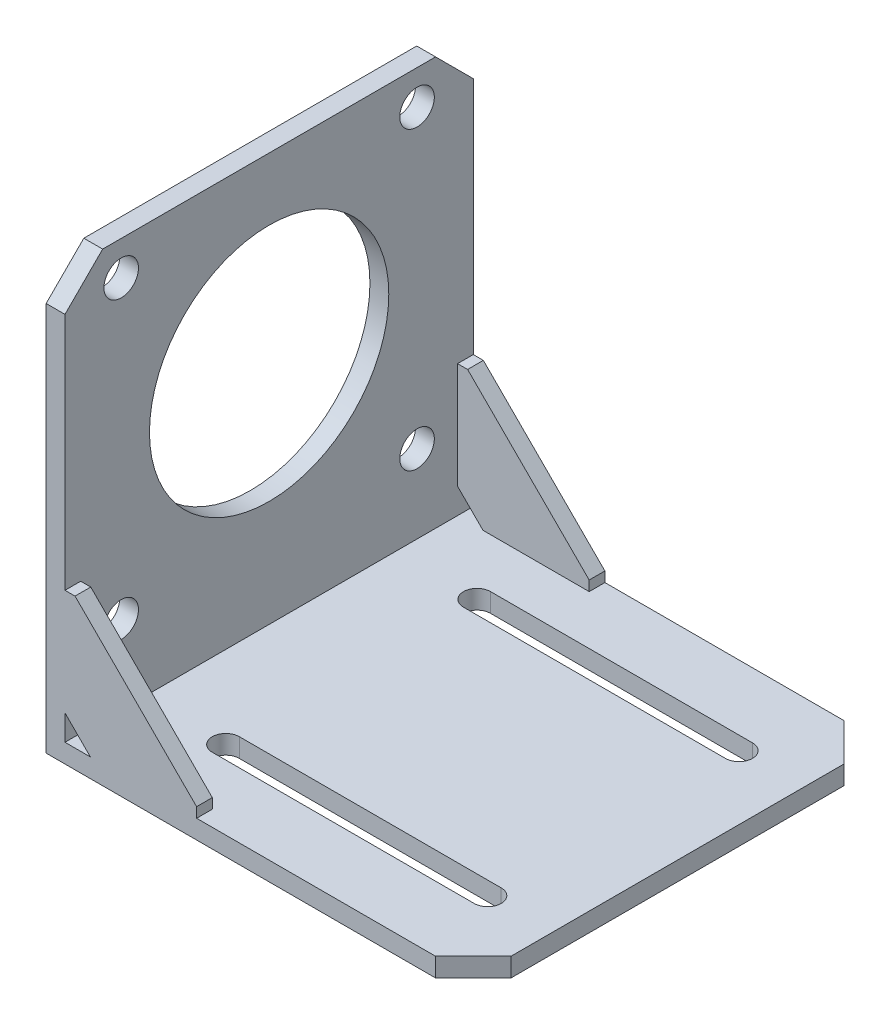
ISO-10303-21;
HEADER;
FILE_DESCRIPTION(('STEP AP214'),'2;1');
FILE_NAME('part.step','',(''),(''),'','','');
FILE_SCHEMA(('AUTOMOTIVE_DESIGN { 1 0 10303 214 1 1 1 1 }'));
ENDSEC;
DATA;
#1=APPLICATION_CONTEXT('core data for automotive mechanical design processes');
#2=APPLICATION_PROTOCOL_DEFINITION('international standard','automotive_design',2000,#1);
#3=PRODUCT_CONTEXT('',#1,'mechanical');
#4=PRODUCT('Part','Part','',(#3));
#5=PRODUCT_RELATED_PRODUCT_CATEGORY('part','',(#4));
#6=PRODUCT_DEFINITION_FORMATION('','',#4);
#7=PRODUCT_DEFINITION_CONTEXT('part definition',#1,'design');
#8=PRODUCT_DEFINITION('design','',#6,#7);
#9=PRODUCT_DEFINITION_SHAPE('','',#8);
#10=(LENGTH_UNIT() NAMED_UNIT(*) SI_UNIT(.MILLI.,.METRE.));
#11=(NAMED_UNIT(*) PLANE_ANGLE_UNIT() SI_UNIT($,.RADIAN.));
#12=(NAMED_UNIT(*) SI_UNIT($,.STERADIAN.) SOLID_ANGLE_UNIT());
#13=UNCERTAINTY_MEASURE_WITH_UNIT(LENGTH_MEASURE(1.E-05),#10,'distance_accuracy_value','');
#14=(GEOMETRIC_REPRESENTATION_CONTEXT(3) GLOBAL_UNCERTAINTY_ASSIGNED_CONTEXT((#13)) GLOBAL_UNIT_ASSIGNED_CONTEXT((#10,
#11,#12)) REPRESENTATION_CONTEXT('',''));
#15=CARTESIAN_POINT('',(0.,0.,0.));
#16=DIRECTION('',(0.,0.,1.));
#17=DIRECTION('',(1.,0.,0.));
#18=AXIS2_PLACEMENT_3D('',#15,#16,#17);
#19=CARTESIAN_POINT('',(3.,3.,65.));
#20=DIRECTION('',(0.,-1.,0.));
#21=DIRECTION('',(1.,0.,0.));
#22=AXIS2_PLACEMENT_3D('',#19,#20,#21);
#23=PLANE('',#22);
#24=DIRECTION('',(-1.,0.,0.));
#25=VECTOR('',#24,1.);
#26=CARTESIAN_POINT('',(16.1,3.,14.65));
#27=LINE('',#26,#25);
#28=CARTESIAN_POINT('',(57.8,3.,14.65));
#29=VERTEX_POINT('',#28);
#30=CARTESIAN_POINT('',(16.1,3.,14.65));
#31=VERTEX_POINT('',#30);
#32=EDGE_CURVE('E236',#29,#31,#27,.T.);
#33=ORIENTED_EDGE('',*,*,#32,.T.);
#34=CARTESIAN_POINT('',(16.1,3.,12.5));
#35=DIRECTION('',(0.,-1.,0.));
#36=DIRECTION('',(1.,0.,0.));
#37=AXIS2_PLACEMENT_3D('',#34,#35,#36);
#38=CIRCLE('',#37,2.15);
#39=CARTESIAN_POINT('',(16.1,3.,10.35));
#40=VERTEX_POINT('',#39);
#41=EDGE_CURVE('E230',#31,#40,#38,.T.);
#42=ORIENTED_EDGE('',*,*,#41,.T.);
#43=DIRECTION('',(1.,0.,0.));
#44=VECTOR('',#43,1.);
#45=CARTESIAN_POINT('',(16.1,3.,10.35));
#46=LINE('',#45,#44);
#47=CARTESIAN_POINT('',(57.8,3.,10.35));
#48=VERTEX_POINT('',#47);
#49=EDGE_CURVE('E239',#40,#48,#46,.T.);
#50=ORIENTED_EDGE('',*,*,#49,.T.);
#51=CARTESIAN_POINT('',(57.8,3.,12.5));
#52=DIRECTION('',(0.,-1.,0.));
#53=DIRECTION('',(1.,0.,0.));
#54=AXIS2_PLACEMENT_3D('',#51,#52,#53);
#55=CIRCLE('',#54,2.15);
#56=EDGE_CURVE('E47',#48,#29,#55,.T.);
#57=ORIENTED_EDGE('',*,*,#56,.T.);
#58=EDGE_LOOP('',(#33,#42,#50,#57));
#59=FACE_BOUND('',#58,.T.);
#60=DIRECTION('',(-1.,0.,0.));
#61=VECTOR('',#60,1.);
#62=CARTESIAN_POINT('',(16.1,3.,54.65));
#63=LINE('',#62,#61);
#64=CARTESIAN_POINT('',(57.8,3.,54.65));
#65=VERTEX_POINT('',#64);
#66=CARTESIAN_POINT('',(16.1,3.,54.65));
#67=VERTEX_POINT('',#66);
#68=EDGE_CURVE('E274',#65,#67,#63,.T.);
#69=ORIENTED_EDGE('',*,*,#68,.T.);
#70=CARTESIAN_POINT('',(16.1,3.,52.5));
#71=DIRECTION('',(0.,-1.,0.));
#72=DIRECTION('',(1.,0.,0.));
#73=AXIS2_PLACEMENT_3D('',#70,#71,#72);
#74=CIRCLE('',#73,2.15);
#75=CARTESIAN_POINT('',(16.1,3.,50.35));
#76=VERTEX_POINT('',#75);
#77=EDGE_CURVE('E264',#67,#76,#74,.T.);
#78=ORIENTED_EDGE('',*,*,#77,.T.);
#79=DIRECTION('',(1.,0.,0.));
#80=VECTOR('',#79,1.);
#81=CARTESIAN_POINT('',(16.1,3.,50.35));
#82=LINE('',#81,#80);
#83=CARTESIAN_POINT('',(57.8,3.,50.35));
#84=VERTEX_POINT('',#83);
#85=EDGE_CURVE('E267',#76,#84,#82,.T.);
#86=ORIENTED_EDGE('',*,*,#85,.T.);
#87=CARTESIAN_POINT('',(57.8,3.,52.5));
#88=DIRECTION('',(0.,-1.,0.));
#89=DIRECTION('',(1.,0.,0.));
#90=AXIS2_PLACEMENT_3D('',#87,#88,#89);
#91=CIRCLE('',#90,2.15);
#92=EDGE_CURVE('E271',#84,#65,#91,.T.);
#93=ORIENTED_EDGE('',*,*,#92,.T.);
#94=EDGE_LOOP('',(#69,#78,#86,#93));
#95=FACE_BOUND('',#94,.T.);
#96=DIRECTION('',(0.,0.,-1.));
#97=VECTOR('',#96,1.);
#98=CARTESIAN_POINT('',(7.04782201567098,3.00000000000002,2.5));
#99=LINE('',#98,#97);
#100=CARTESIAN_POINT('',(7.04782201567101,3.,2.5));
#101=VERTEX_POINT('',#100);
#102=CARTESIAN_POINT('',(7.04782201567098,3.00000000000002,0.));
#103=VERTEX_POINT('',#102);
#104=EDGE_CURVE('E352',#101,#103,#99,.T.);
#105=ORIENTED_EDGE('',*,*,#104,.T.);
#106=DIRECTION('',(-1.,0.,0.));
#107=VECTOR('',#106,1.);
#108=CARTESIAN_POINT('',(3.,3.,0.));
#109=LINE('',#108,#107);
#110=CARTESIAN_POINT('',(3.,3.,0.));
#111=VERTEX_POINT('',#110);
#112=EDGE_CURVE('E430',#103,#111,#109,.T.);
#113=ORIENTED_EDGE('',*,*,#112,.T.);
#114=DIRECTION('',(0.,0.,-1.));
#115=VECTOR('',#114,1.);
#116=CARTESIAN_POINT('',(3.,3.,65.));
#117=LINE('',#116,#115);
#118=CARTESIAN_POINT('',(3.,3.,65.));
#119=VERTEX_POINT('',#118);
#120=EDGE_CURVE('E445',#119,#111,#117,.T.);
#121=ORIENTED_EDGE('',*,*,#120,.F.);
#122=DIRECTION('',(-1.,0.,0.));
#123=VECTOR('',#122,1.);
#124=CARTESIAN_POINT('',(3.,3.,65.));
#125=LINE('',#124,#123);
#126=CARTESIAN_POINT('',(7.04782201567098,3.,65.));
#127=VERTEX_POINT('',#126);
#128=EDGE_CURVE('E416',#127,#119,#125,.T.);
#129=ORIENTED_EDGE('',*,*,#128,.F.);
#130=DIRECTION('',(0.,0.,1.));
#131=VECTOR('',#130,1.);
#132=CARTESIAN_POINT('',(7.04782201567098,3.00000000000002,62.5));
#133=LINE('',#132,#131);
#134=CARTESIAN_POINT('',(7.04782201567098,3.00000000000002,62.5));
#135=VERTEX_POINT('',#134);
#136=EDGE_CURVE('E388',#135,#127,#133,.T.);
#137=ORIENTED_EDGE('',*,*,#136,.F.);
#138=DIRECTION('',(1.,0.,0.));
#139=VECTOR('',#138,1.);
#140=CARTESIAN_POINT('',(23.9558780924768,3.00000000000002,62.5));
#141=LINE('',#140,#139);
#142=CARTESIAN_POINT('',(23.9558780924768,3.00000000000002,62.5));
#143=VERTEX_POINT('',#142);
#144=EDGE_CURVE('E373',#135,#143,#141,.T.);
#145=ORIENTED_EDGE('',*,*,#144,.T.);
#146=DIRECTION('',(0.,0.,1.));
#147=VECTOR('',#146,1.);
#148=CARTESIAN_POINT('',(23.9558780924768,3.00000000000002,62.5));
#149=LINE('',#148,#147);
#150=CARTESIAN_POINT('',(23.9558780924768,3.00000000000002,65.));
#151=VERTEX_POINT('',#150);
#152=EDGE_CURVE('E408',#143,#151,#149,.T.);
#153=ORIENTED_EDGE('',*,*,#152,.T.);
#154=CARTESIAN_POINT('',(62.,3.,65.));
#155=VERTEX_POINT('',#154);
#156=EDGE_CURVE('E418',#155,#151,#125,.T.);
#157=ORIENTED_EDGE('',*,*,#156,.F.);
#158=DIRECTION('',(-0.707106781186546,0.,0.707106781186549));
#159=VECTOR('',#158,1.);
#160=CARTESIAN_POINT('',(62.,3.,65.));
#161=LINE('',#160,#159);
#162=CARTESIAN_POINT('',(68.,3.,59.));
#163=VERTEX_POINT('',#162);
#164=EDGE_CURVE('E462',#155,#163,#161,.F.);
#165=ORIENTED_EDGE('',*,*,#164,.T.);
#166=DIRECTION('',(0.,0.,-1.));
#167=VECTOR('',#166,1.);
#168=CARTESIAN_POINT('',(68.,3.,65.));
#169=LINE('',#168,#167);
#170=CARTESIAN_POINT('',(68.,3.,6.));
#171=VERTEX_POINT('',#170);
#172=EDGE_CURVE('E448',#163,#171,#169,.T.);
#173=ORIENTED_EDGE('',*,*,#172,.T.);
#174=DIRECTION('',(-0.70710678118655,0.,-0.707106781186546));
#175=VECTOR('',#174,1.);
#176=CARTESIAN_POINT('',(68.,3.,5.99999999999999));
#177=LINE('',#176,#175);
#178=CARTESIAN_POINT('',(62.,3.,0.));
#179=VERTEX_POINT('',#178);
#180=EDGE_CURVE('E460',#171,#179,#177,.T.);
#181=ORIENTED_EDGE('',*,*,#180,.T.);
#182=CARTESIAN_POINT('',(23.9558780924768,3.,0.));
#183=VERTEX_POINT('',#182);
#184=EDGE_CURVE('E431',#179,#183,#109,.T.);
#185=ORIENTED_EDGE('',*,*,#184,.T.);
#186=DIRECTION('',(0.,0.,-1.));
#187=VECTOR('',#186,1.);
#188=CARTESIAN_POINT('',(23.9558780924768,3.00000000000002,2.5));
#189=LINE('',#188,#187);
#190=CARTESIAN_POINT('',(23.9558780924768,3.,2.5));
#191=VERTEX_POINT('',#190);
#192=EDGE_CURVE('E356',#191,#183,#189,.T.);
#193=ORIENTED_EDGE('',*,*,#192,.F.);
#194=DIRECTION('',(1.,0.,0.));
#195=VECTOR('',#194,1.);
#196=CARTESIAN_POINT('',(23.9558780924768,3.00000000000002,2.5));
#197=LINE('',#196,#195);
#198=EDGE_CURVE('E340',#101,#191,#197,.T.);
#199=ORIENTED_EDGE('',*,*,#198,.F.);
#200=EDGE_LOOP('',(#105,#113,#121,#129,#137,#145,#153,#157,#165,#173,#181,#185,#193,#199));
#201=FACE_BOUND('',#200,.T.);
#202=ADVANCED_FACE('F32',(#59,#95,#201),#23,.F.);
#203=CARTESIAN_POINT('',(3.,68.,65.));
#204=DIRECTION('',(-1.,0.,0.));
#205=DIRECTION('',(0.,-1.,0.));
#206=AXIS2_PLACEMENT_3D('',#203,#204,#205);
#207=PLANE('',#206);
#208=CARTESIAN_POINT('',(3.,15.45,56.05));
#209=DIRECTION('',(-1.,0.,0.));
#210=DIRECTION('',(0.,0.,1.));
#211=AXIS2_PLACEMENT_3D('',#208,#209,#210);
#212=CIRCLE('',#211,2.75);
#213=CARTESIAN_POINT('',(3.,15.45,58.8));
#214=VERTEX_POINT('',#213);
#215=EDGE_CURVE('E296',#214,#214,#212,.T.);
#216=ORIENTED_EDGE('',*,*,#215,.T.);
#217=EDGE_LOOP('',(#216));
#218=FACE_BOUND('',#217,.T.);
#219=CARTESIAN_POINT('',(3.,15.45,8.94999999999999));
#220=DIRECTION('',(-1.,0.,0.));
#221=DIRECTION('',(0.,0.,1.));
#222=AXIS2_PLACEMENT_3D('',#219,#220,#221);
#223=CIRCLE('',#222,2.75);
#224=CARTESIAN_POINT('',(3.,15.45,11.7));
#225=VERTEX_POINT('',#224);
#226=EDGE_CURVE('E302',#225,#225,#223,.T.);
#227=ORIENTED_EDGE('',*,*,#226,.T.);
#228=EDGE_LOOP('',(#227));
#229=FACE_BOUND('',#228,.T.);
#230=CARTESIAN_POINT('',(3.,62.55,56.05));
#231=DIRECTION('',(-1.,0.,0.));
#232=DIRECTION('',(0.,0.,1.));
#233=AXIS2_PLACEMENT_3D('',#230,#231,#232);
#234=CIRCLE('',#233,2.75);
#235=CARTESIAN_POINT('',(3.,62.55,58.8));
#236=VERTEX_POINT('',#235);
#237=EDGE_CURVE('E308',#236,#236,#234,.T.);
#238=ORIENTED_EDGE('',*,*,#237,.T.);
#239=EDGE_LOOP('',(#238));
#240=FACE_BOUND('',#239,.T.);
#241=CARTESIAN_POINT('',(3.,62.55,8.94999999999998));
#242=DIRECTION('',(-1.,0.,0.));
#243=DIRECTION('',(0.,0.,1.));
#244=AXIS2_PLACEMENT_3D('',#241,#242,#243);
#245=CIRCLE('',#244,2.75);
#246=CARTESIAN_POINT('',(3.,62.55,11.7));
#247=VERTEX_POINT('',#246);
#248=EDGE_CURVE('E314',#247,#247,#245,.T.);
#249=ORIENTED_EDGE('',*,*,#248,.T.);
#250=EDGE_LOOP('',(#249));
#251=FACE_BOUND('',#250,.T.);
#252=CARTESIAN_POINT('',(3.,39.,32.5));
#253=DIRECTION('',(-1.,0.,0.));
#254=DIRECTION('',(0.,0.,1.));
#255=AXIS2_PLACEMENT_3D('',#252,#253,#254);
#256=CIRCLE('',#255,19.05);
#257=CARTESIAN_POINT('',(3.,39.,51.55));
#258=VERTEX_POINT('',#257);
#259=EDGE_CURVE('E320',#258,#258,#256,.T.);
#260=ORIENTED_EDGE('',*,*,#259,.T.);
#261=EDGE_LOOP('',(#260));
#262=FACE_BOUND('',#261,.T.);
#263=DIRECTION('',(0.,0.,-1.));
#264=VECTOR('',#263,1.);
#265=CARTESIAN_POINT('',(3.,7.04782201567103,2.5));
#266=LINE('',#265,#264);
#267=CARTESIAN_POINT('',(3.,7.04782201567103,2.5));
#268=VERTEX_POINT('',#267);
#269=CARTESIAN_POINT('',(3.,7.04782201567103,0.));
#270=VERTEX_POINT('',#269);
#271=EDGE_CURVE('E343',#268,#270,#266,.T.);
#272=ORIENTED_EDGE('',*,*,#271,.F.);
#273=DIRECTION('',(0.,-1.,0.));
#274=VECTOR('',#273,1.);
#275=CARTESIAN_POINT('',(3.,7.04782201567103,2.5));
#276=LINE('',#275,#274);
#277=CARTESIAN_POINT('',(3.,23.9558780924771,2.5));
#278=VERTEX_POINT('',#277);
#279=EDGE_CURVE('E329',#278,#268,#276,.T.);
#280=ORIENTED_EDGE('',*,*,#279,.F.);
#281=DIRECTION('',(0.,0.,-1.));
#282=VECTOR('',#281,1.);
#283=CARTESIAN_POINT('',(3.00000000000002,23.9558780924771,2.5));
#284=LINE('',#283,#282);
#285=CARTESIAN_POINT('',(3.00000000000002,23.9558780924771,0.));
#286=VERTEX_POINT('',#285);
#287=EDGE_CURVE('E365',#278,#286,#284,.T.);
#288=ORIENTED_EDGE('',*,*,#287,.T.);
#289=DIRECTION('',(0.,1.,0.));
#290=VECTOR('',#289,1.);
#291=CARTESIAN_POINT('',(3.,68.,0.));
#292=LINE('',#291,#290);
#293=CARTESIAN_POINT('',(3.,62.,0.));
#294=VERTEX_POINT('',#293);
#295=EDGE_CURVE('E433',#286,#294,#292,.T.);
#296=ORIENTED_EDGE('',*,*,#295,.T.);
#297=DIRECTION('',(0.,0.70710678118655,0.707106781186546));
#298=VECTOR('',#297,1.);
#299=CARTESIAN_POINT('',(3.,68.,5.99999999999999));
#300=LINE('',#299,#298);
#301=CARTESIAN_POINT('',(3.,68.,6.));
#302=VERTEX_POINT('',#301);
#303=EDGE_CURVE('E11',#294,#302,#300,.T.);
#304=ORIENTED_EDGE('',*,*,#303,.T.);
#305=DIRECTION('',(0.,0.,-1.));
#306=VECTOR('',#305,1.);
#307=CARTESIAN_POINT('',(3.,68.,65.));
#308=LINE('',#307,#306);
#309=CARTESIAN_POINT('',(3.,68.,59.));
#310=VERTEX_POINT('',#309);
#311=EDGE_CURVE('E442',#310,#302,#308,.T.);
#312=ORIENTED_EDGE('',*,*,#311,.F.);
#313=DIRECTION('',(0.,0.707106781186545,-0.70710678118655));
#314=VECTOR('',#313,1.);
#315=CARTESIAN_POINT('',(3.,62.,65.));
#316=LINE('',#315,#314);
#317=CARTESIAN_POINT('',(3.,62.,65.));
#318=VERTEX_POINT('',#317);
#319=EDGE_CURVE('E40',#310,#318,#316,.F.);
#320=ORIENTED_EDGE('',*,*,#319,.T.);
#321=DIRECTION('',(0.,1.,0.));
#322=VECTOR('',#321,1.);
#323=CARTESIAN_POINT('',(3.,68.,65.));
#324=LINE('',#323,#322);
#325=CARTESIAN_POINT('',(3.,23.955878092477,65.));
#326=VERTEX_POINT('',#325);
#327=EDGE_CURVE('E421',#326,#318,#324,.T.);
#328=ORIENTED_EDGE('',*,*,#327,.F.);
#329=DIRECTION('',(0.,0.,1.));
#330=VECTOR('',#329,1.);
#331=CARTESIAN_POINT('',(3.00000000000002,23.9558780924771,62.5));
#332=LINE('',#331,#330);
#333=CARTESIAN_POINT('',(3.00000000000002,23.9558780924771,62.5));
#334=VERTEX_POINT('',#333);
#335=EDGE_CURVE('E401',#334,#326,#332,.T.);
#336=ORIENTED_EDGE('',*,*,#335,.F.);
#337=DIRECTION('',(0.,-1.,0.));
#338=VECTOR('',#337,1.);
#339=CARTESIAN_POINT('',(3.,7.04782201567103,62.5));
#340=LINE('',#339,#338);
#341=CARTESIAN_POINT('',(3.,7.04782201567103,62.5));
#342=VERTEX_POINT('',#341);
#343=EDGE_CURVE('E385',#334,#342,#340,.T.);
#344=ORIENTED_EDGE('',*,*,#343,.T.);
#345=DIRECTION('',(0.,0.,1.));
#346=VECTOR('',#345,1.);
#347=CARTESIAN_POINT('',(3.,7.04782201567103,62.5));
#348=LINE('',#347,#346);
#349=CARTESIAN_POINT('',(3.,7.04782201567103,65.));
#350=VERTEX_POINT('',#349);
#351=EDGE_CURVE('E397',#342,#350,#348,.T.);
#352=ORIENTED_EDGE('',*,*,#351,.T.);
#353=EDGE_CURVE('E422',#119,#350,#324,.T.);
#354=ORIENTED_EDGE('',*,*,#353,.F.);
#355=ORIENTED_EDGE('',*,*,#120,.T.);
#356=EDGE_CURVE('E434',#111,#270,#292,.T.);
#357=ORIENTED_EDGE('',*,*,#356,.T.);
#358=EDGE_LOOP('',(#272,#280,#288,#296,#304,#312,#320,#328,#336,#344,#352,#354,#355,#357));
#359=FACE_BOUND('',#358,.T.);
#360=ADVANCED_FACE('F492',(#218,#229,#240,#251,#262,#359),#207,.F.);
#361=CARTESIAN_POINT('',(68.,0.,65.));
#362=DIRECTION('',(0.,1.,0.));
#363=DIRECTION('',(-1.,0.,0.));
#364=AXIS2_PLACEMENT_3D('',#361,#362,#363);
#365=PLANE('',#364);
#366=DIRECTION('',(1.,0.,0.));
#367=VECTOR('',#366,1.);
#368=CARTESIAN_POINT('',(16.1,0.,10.35));
#369=LINE('',#368,#367);
#370=CARTESIAN_POINT('',(16.1,0.,10.35));
#371=VERTEX_POINT('',#370);
#372=CARTESIAN_POINT('',(57.8,0.,10.35));
#373=VERTEX_POINT('',#372);
#374=EDGE_CURVE('E254',#371,#373,#369,.T.);
#375=ORIENTED_EDGE('',*,*,#374,.F.);
#376=CARTESIAN_POINT('',(16.1,0.,12.5));
#377=DIRECTION('',(0.,-1.,0.));
#378=DIRECTION('',(1.,0.,0.));
#379=AXIS2_PLACEMENT_3D('',#376,#377,#378);
#380=CIRCLE('',#379,2.15);
#381=CARTESIAN_POINT('',(16.1,0.,14.65));
#382=VERTEX_POINT('',#381);
#383=EDGE_CURVE('E55',#382,#371,#380,.T.);
#384=ORIENTED_EDGE('',*,*,#383,.F.);
#385=DIRECTION('',(-1.,0.,0.));
#386=VECTOR('',#385,1.);
#387=CARTESIAN_POINT('',(16.1,0.,14.65));
#388=LINE('',#387,#386);
#389=CARTESIAN_POINT('',(57.8,0.,14.65));
#390=VERTEX_POINT('',#389);
#391=EDGE_CURVE('E245',#390,#382,#388,.T.);
#392=ORIENTED_EDGE('',*,*,#391,.F.);
#393=CARTESIAN_POINT('',(57.8,0.,12.5));
#394=DIRECTION('',(0.,-1.,0.));
#395=DIRECTION('',(1.,0.,0.));
#396=AXIS2_PLACEMENT_3D('',#393,#394,#395);
#397=CIRCLE('',#396,2.15);
#398=EDGE_CURVE('E248',#373,#390,#397,.T.);
#399=ORIENTED_EDGE('',*,*,#398,.F.);
#400=EDGE_LOOP('',(#375,#384,#392,#399));
#401=FACE_BOUND('',#400,.T.);
#402=DIRECTION('',(1.,0.,0.));
#403=VECTOR('',#402,1.);
#404=CARTESIAN_POINT('',(16.1,0.,50.35));
#405=LINE('',#404,#403);
#406=CARTESIAN_POINT('',(16.1,0.,50.35));
#407=VERTEX_POINT('',#406);
#408=CARTESIAN_POINT('',(57.8,0.,50.35));
#409=VERTEX_POINT('',#408);
#410=EDGE_CURVE('E279',#407,#409,#405,.T.);
#411=ORIENTED_EDGE('',*,*,#410,.F.);
#412=CARTESIAN_POINT('',(16.1,0.,52.5));
#413=DIRECTION('',(0.,-1.,0.));
#414=DIRECTION('',(1.,0.,0.));
#415=AXIS2_PLACEMENT_3D('',#412,#413,#414);
#416=CIRCLE('',#415,2.15);
#417=CARTESIAN_POINT('',(16.1,0.,54.65));
#418=VERTEX_POINT('',#417);
#419=EDGE_CURVE('E260',#418,#407,#416,.T.);
#420=ORIENTED_EDGE('',*,*,#419,.F.);
#421=DIRECTION('',(-1.,0.,0.));
#422=VECTOR('',#421,1.);
#423=CARTESIAN_POINT('',(16.1,0.,54.65));
#424=LINE('',#423,#422);
#425=CARTESIAN_POINT('',(57.8,0.,54.65));
#426=VERTEX_POINT('',#425);
#427=EDGE_CURVE('E268',#426,#418,#424,.T.);
#428=ORIENTED_EDGE('',*,*,#427,.F.);
#429=CARTESIAN_POINT('',(57.8,0.,52.5));
#430=DIRECTION('',(0.,-1.,0.));
#431=DIRECTION('',(1.,0.,0.));
#432=AXIS2_PLACEMENT_3D('',#429,#430,#431);
#433=CIRCLE('',#432,2.15);
#434=EDGE_CURVE('E282',#409,#426,#433,.T.);
#435=ORIENTED_EDGE('',*,*,#434,.F.);
#436=EDGE_LOOP('',(#411,#420,#428,#435));
#437=FACE_BOUND('',#436,.T.);
#438=DIRECTION('',(0.,0.,-1.));
#439=VECTOR('',#438,1.);
#440=CARTESIAN_POINT('',(68.,0.,65.));
#441=LINE('',#440,#439);
#442=CARTESIAN_POINT('',(68.,0.,59.));
#443=VERTEX_POINT('',#442);
#444=CARTESIAN_POINT('',(68.,0.,6.));
#445=VERTEX_POINT('',#444);
#446=EDGE_CURVE('E451',#443,#445,#441,.T.);
#447=ORIENTED_EDGE('',*,*,#446,.F.);
#448=DIRECTION('',(0.707106781186546,0.,-0.707106781186549));
#449=VECTOR('',#448,1.);
#450=CARTESIAN_POINT('',(62.,0.,65.));
#451=LINE('',#450,#449);
#452=CARTESIAN_POINT('',(62.,0.,65.));
#453=VERTEX_POINT('',#452);
#454=EDGE_CURVE('E471',#443,#453,#451,.F.);
#455=ORIENTED_EDGE('',*,*,#454,.T.);
#456=DIRECTION('',(1.,0.,0.));
#457=VECTOR('',#456,1.);
#458=CARTESIAN_POINT('',(68.,0.,65.));
#459=LINE('',#458,#457);
#460=CARTESIAN_POINT('',(0.,0.,65.));
#461=VERTEX_POINT('',#460);
#462=EDGE_CURVE('E413',#461,#453,#459,.T.);
#463=ORIENTED_EDGE('',*,*,#462,.F.);
#464=DIRECTION('',(0.,0.,-1.));
#465=VECTOR('',#464,1.);
#466=CARTESIAN_POINT('',(0.,0.,65.));
#467=LINE('',#466,#465);
#468=CARTESIAN_POINT('',(0.,0.,0.));
#469=VERTEX_POINT('',#468);
#470=EDGE_CURVE('E427',#461,#469,#467,.T.);
#471=ORIENTED_EDGE('',*,*,#470,.T.);
#472=DIRECTION('',(1.,0.,0.));
#473=VECTOR('',#472,1.);
#474=CARTESIAN_POINT('',(68.,0.,0.));
#475=LINE('',#474,#473);
#476=CARTESIAN_POINT('',(62.,0.,0.));
#477=VERTEX_POINT('',#476);
#478=EDGE_CURVE('E400',#469,#477,#475,.T.);
#479=ORIENTED_EDGE('',*,*,#478,.T.);
#480=DIRECTION('',(0.70710678118655,0.,0.707106781186546));
#481=VECTOR('',#480,1.);
#482=CARTESIAN_POINT('',(68.,0.,6.));
#483=LINE('',#482,#481);
#484=EDGE_CURVE('E469',#477,#445,#483,.T.);
#485=ORIENTED_EDGE('',*,*,#484,.T.);
#486=EDGE_LOOP('',(#447,#455,#463,#471,#479,#485));
#487=FACE_BOUND('',#486,.T.);
#488=ADVANCED_FACE('F508',(#401,#437,#487),#365,.F.);
#489=CARTESIAN_POINT('',(68.,3.,65.));
#490=DIRECTION('',(-1.,0.,0.));
#491=DIRECTION('',(0.,-1.,0.));
#492=AXIS2_PLACEMENT_3D('',#489,#490,#491);
#493=PLANE('',#492);
#494=ORIENTED_EDGE('',*,*,#172,.F.);
#495=DIRECTION('',(0.,-1.,0.));
#496=VECTOR('',#495,1.);
#497=CARTESIAN_POINT('',(68.,3.,59.));
#498=LINE('',#497,#496);
#499=EDGE_CURVE('E467',#163,#443,#498,.T.);
#500=ORIENTED_EDGE('',*,*,#499,.T.);
#501=ORIENTED_EDGE('',*,*,#446,.T.);
#502=DIRECTION('',(0.,1.,0.));
#503=VECTOR('',#502,1.);
#504=CARTESIAN_POINT('',(68.,3.,5.99999999999999));
#505=LINE('',#504,#503);
#506=EDGE_CURVE('E464',#445,#171,#505,.T.);
#507=ORIENTED_EDGE('',*,*,#506,.T.);
#508=EDGE_LOOP('',(#494,#500,#501,#507));
#509=FACE_BOUND('',#508,.T.);
#510=ADVANCED_FACE('F518',(#509),#493,.F.);
#511=CARTESIAN_POINT('',(0.,68.,65.));
#512=DIRECTION('',(0.,-1.,0.));
#513=DIRECTION('',(0.,0.,-1.));
#514=AXIS2_PLACEMENT_3D('',#511,#512,#513);
#515=PLANE('',#514);
#516=ORIENTED_EDGE('',*,*,#311,.T.);
#517=DIRECTION('',(-1.,0.,0.));
#518=VECTOR('',#517,1.);
#519=CARTESIAN_POINT('',(0.,68.,5.99999999999999));
#520=LINE('',#519,#518);
#521=CARTESIAN_POINT('',(0.,68.,6.));
#522=VERTEX_POINT('',#521);
#523=EDGE_CURVE('E480',#302,#522,#520,.T.);
#524=ORIENTED_EDGE('',*,*,#523,.T.);
#525=DIRECTION('',(0.,0.,-1.));
#526=VECTOR('',#525,1.);
#527=CARTESIAN_POINT('',(0.,68.,65.));
#528=LINE('',#527,#526);
#529=CARTESIAN_POINT('',(0.,68.,59.));
#530=VERTEX_POINT('',#529);
#531=EDGE_CURVE('E439',#530,#522,#528,.T.);
#532=ORIENTED_EDGE('',*,*,#531,.F.);
#533=DIRECTION('',(1.,0.,0.));
#534=VECTOR('',#533,1.);
#535=CARTESIAN_POINT('',(0.,68.,59.));
#536=LINE('',#535,#534);
#537=EDGE_CURVE('E478',#530,#310,#536,.T.);
#538=ORIENTED_EDGE('',*,*,#537,.T.);
#539=EDGE_LOOP('',(#516,#524,#532,#538));
#540=FACE_BOUND('',#539,.T.);
#541=ADVANCED_FACE('F591',(#540),#515,.F.);
#542=CARTESIAN_POINT('',(0.,0.,65.));
#543=DIRECTION('',(1.,0.,0.));
#544=DIRECTION('',(0.,0.,-1.));
#545=AXIS2_PLACEMENT_3D('',#542,#543,#544);
#546=PLANE('',#545);
#547=CARTESIAN_POINT('',(0.,15.45,56.05));
#548=DIRECTION('',(-1.,0.,0.));
#549=DIRECTION('',(0.,0.,1.));
#550=AXIS2_PLACEMENT_3D('',#547,#548,#549);
#551=CIRCLE('',#550,2.75);
#552=CARTESIAN_POINT('',(0.,15.45,58.8));
#553=VERTEX_POINT('',#552);
#554=EDGE_CURVE('E289',#553,#553,#551,.T.);
#555=ORIENTED_EDGE('',*,*,#554,.F.);
#556=EDGE_LOOP('',(#555));
#557=FACE_BOUND('',#556,.T.);
#558=CARTESIAN_POINT('',(0.,15.45,8.94999999999999));
#559=DIRECTION('',(-1.,0.,0.));
#560=DIRECTION('',(0.,0.,1.));
#561=AXIS2_PLACEMENT_3D('',#558,#559,#560);
#562=CIRCLE('',#561,2.75);
#563=CARTESIAN_POINT('',(0.,15.45,11.7));
#564=VERTEX_POINT('',#563);
#565=EDGE_CURVE('E299',#564,#564,#562,.T.);
#566=ORIENTED_EDGE('',*,*,#565,.F.);
#567=EDGE_LOOP('',(#566));
#568=FACE_BOUND('',#567,.T.);
#569=CARTESIAN_POINT('',(0.,62.55,56.05));
#570=DIRECTION('',(-1.,0.,0.));
#571=DIRECTION('',(0.,0.,1.));
#572=AXIS2_PLACEMENT_3D('',#569,#570,#571);
#573=CIRCLE('',#572,2.75);
#574=CARTESIAN_POINT('',(0.,62.55,58.8));
#575=VERTEX_POINT('',#574);
#576=EDGE_CURVE('E305',#575,#575,#573,.T.);
#577=ORIENTED_EDGE('',*,*,#576,.F.);
#578=EDGE_LOOP('',(#577));
#579=FACE_BOUND('',#578,.T.);
#580=CARTESIAN_POINT('',(0.,62.55,8.94999999999998));
#581=DIRECTION('',(-1.,0.,0.));
#582=DIRECTION('',(0.,0.,1.));
#583=AXIS2_PLACEMENT_3D('',#580,#581,#582);
#584=CIRCLE('',#583,2.75);
#585=CARTESIAN_POINT('',(0.,62.55,11.7));
#586=VERTEX_POINT('',#585);
#587=EDGE_CURVE('E311',#586,#586,#584,.T.);
#588=ORIENTED_EDGE('',*,*,#587,.F.);
#589=EDGE_LOOP('',(#588));
#590=FACE_BOUND('',#589,.T.);
#591=CARTESIAN_POINT('',(0.,39.,32.5));
#592=DIRECTION('',(-1.,0.,0.));
#593=DIRECTION('',(0.,0.,1.));
#594=AXIS2_PLACEMENT_3D('',#591,#592,#593);
#595=CIRCLE('',#594,19.05);
#596=CARTESIAN_POINT('',(0.,39.,51.55));
#597=VERTEX_POINT('',#596);
#598=EDGE_CURVE('E317',#597,#597,#595,.T.);
#599=ORIENTED_EDGE('',*,*,#598,.F.);
#600=EDGE_LOOP('',(#599));
#601=FACE_BOUND('',#600,.T.);
#602=ORIENTED_EDGE('',*,*,#531,.T.);
#603=DIRECTION('',(0.,-0.70710678118655,-0.707106781186546));
#604=VECTOR('',#603,1.);
#605=CARTESIAN_POINT('',(0.,68.,5.99999999999999));
#606=LINE('',#605,#604);
#607=CARTESIAN_POINT('',(0.,62.,0.));
#608=VERTEX_POINT('',#607);
#609=EDGE_CURVE('E485',#522,#608,#606,.T.);
#610=ORIENTED_EDGE('',*,*,#609,.T.);
#611=DIRECTION('',(0.,-1.,0.));
#612=VECTOR('',#611,1.);
#613=CARTESIAN_POINT('',(0.,0.,0.));
#614=LINE('',#613,#612);
#615=EDGE_CURVE('E417',#608,#469,#614,.T.);
#616=ORIENTED_EDGE('',*,*,#615,.T.);
#617=ORIENTED_EDGE('',*,*,#470,.F.);
#618=DIRECTION('',(0.,-1.,0.));
#619=VECTOR('',#618,1.);
#620=CARTESIAN_POINT('',(0.,0.,65.));
#621=LINE('',#620,#619);
#622=CARTESIAN_POINT('',(0.,62.,65.));
#623=VERTEX_POINT('',#622);
#624=EDGE_CURVE('E425',#623,#461,#621,.T.);
#625=ORIENTED_EDGE('',*,*,#624,.F.);
#626=DIRECTION('',(0.,-0.707106781186545,0.70710678118655));
#627=VECTOR('',#626,1.);
#628=CARTESIAN_POINT('',(0.,62.,65.));
#629=LINE('',#628,#627);
#630=EDGE_CURVE('E483',#623,#530,#629,.F.);
#631=ORIENTED_EDGE('',*,*,#630,.T.);
#632=EDGE_LOOP('',(#602,#610,#616,#617,#625,#631));
#633=FACE_BOUND('',#632,.T.);
#634=ADVANCED_FACE('F501',(#557,#568,#579,#590,#601,#633),#546,.F.);
#635=CARTESIAN_POINT('',(0.,0.,65.));
#636=DIRECTION('',(0.,0.,-1.));
#637=DIRECTION('',(-1.,0.,0.));
#638=AXIS2_PLACEMENT_3D('',#635,#636,#637);
#639=PLANE('',#638);
#640=ORIENTED_EDGE('',*,*,#353,.T.);
#641=DIRECTION('',(0.707106781186545,-0.70710678118655,0.));
#642=VECTOR('',#641,1.);
#643=CARTESIAN_POINT('',(3.,7.04782201567103,65.));
#644=LINE('',#643,#642);
#645=EDGE_CURVE('E355',#350,#127,#644,.T.);
#646=ORIENTED_EDGE('',*,*,#645,.T.);
#647=ORIENTED_EDGE('',*,*,#128,.T.);
#648=EDGE_LOOP('',(#640,#646,#647));
#649=FACE_BOUND('',#648,.T.);
#650=ORIENTED_EDGE('',*,*,#462,.T.);
#651=DIRECTION('',(0.,1.,0.));
#652=VECTOR('',#651,1.);
#653=CARTESIAN_POINT('',(62.,-2.86807614694832E-13,65.));
#654=LINE('',#653,#652);
#655=EDGE_CURVE('E457',#453,#155,#654,.T.);
#656=ORIENTED_EDGE('',*,*,#655,.T.);
#657=ORIENTED_EDGE('',*,*,#156,.T.);
#658=DIRECTION('',(0.,1.,0.));
#659=VECTOR('',#658,1.);
#660=CARTESIAN_POINT('',(23.9558780924768,4.60018500711891,65.));
#661=LINE('',#660,#659);
#662=CARTESIAN_POINT('',(23.9558780924768,4.60018500711891,65.));
#663=VERTEX_POINT('',#662);
#664=EDGE_CURVE('E390',#151,#663,#661,.T.);
#665=ORIENTED_EDGE('',*,*,#664,.T.);
#666=DIRECTION('',(-0.707106781186544,0.707106781186551,0.));
#667=VECTOR('',#666,1.);
#668=CARTESIAN_POINT('',(4.60018500711891,23.955878092477,65.));
#669=LINE('',#668,#667);
#670=CARTESIAN_POINT('',(4.60018500711891,23.955878092477,65.));
#671=VERTEX_POINT('',#670);
#672=EDGE_CURVE('E393',#663,#671,#669,.T.);
#673=ORIENTED_EDGE('',*,*,#672,.T.);
#674=DIRECTION('',(-1.,0.,0.));
#675=VECTOR('',#674,1.);
#676=CARTESIAN_POINT('',(4.60018500711891,23.955878092477,65.));
#677=LINE('',#676,#675);
#678=EDGE_CURVE('E374',#671,#326,#677,.T.);
#679=ORIENTED_EDGE('',*,*,#678,.T.);
#680=ORIENTED_EDGE('',*,*,#327,.T.);
#681=DIRECTION('',(-1.,0.,0.));
#682=VECTOR('',#681,1.);
#683=CARTESIAN_POINT('',(0.,62.,65.));
#684=LINE('',#683,#682);
#685=EDGE_CURVE('E454',#318,#623,#684,.T.);
#686=ORIENTED_EDGE('',*,*,#685,.T.);
#687=ORIENTED_EDGE('',*,*,#624,.T.);
#688=EDGE_LOOP('',(#650,#656,#657,#665,#673,#679,#680,#686,#687));
#689=FACE_BOUND('',#688,.T.);
#690=ADVANCED_FACE('F498',(#649,#689),#639,.F.);
#691=CARTESIAN_POINT('',(0.,0.,0.));
#692=DIRECTION('',(0.,0.,-1.));
#693=DIRECTION('',(-1.,0.,0.));
#694=AXIS2_PLACEMENT_3D('',#691,#692,#693);
#695=PLANE('',#694);
#696=DIRECTION('',(0.,1.,0.));
#697=VECTOR('',#696,1.);
#698=CARTESIAN_POINT('',(23.9558780924768,4.60018500711891,0.));
#699=LINE('',#698,#697);
#700=CARTESIAN_POINT('',(23.9558780924768,4.60018500711891,0.));
#701=VERTEX_POINT('',#700);
#702=EDGE_CURVE('E330',#183,#701,#699,.T.);
#703=ORIENTED_EDGE('',*,*,#702,.F.);
#704=ORIENTED_EDGE('',*,*,#184,.F.);
#705=DIRECTION('',(0.,-1.,0.));
#706=VECTOR('',#705,1.);
#707=CARTESIAN_POINT('',(62.,0.,0.));
#708=LINE('',#707,#706);
#709=EDGE_CURVE('E476',#179,#477,#708,.T.);
#710=ORIENTED_EDGE('',*,*,#709,.T.);
#711=ORIENTED_EDGE('',*,*,#478,.F.);
#712=ORIENTED_EDGE('',*,*,#615,.F.);
#713=DIRECTION('',(1.,0.,0.));
#714=VECTOR('',#713,1.);
#715=CARTESIAN_POINT('',(3.,62.,0.));
#716=LINE('',#715,#714);
#717=EDGE_CURVE('E473',#608,#294,#716,.T.);
#718=ORIENTED_EDGE('',*,*,#717,.T.);
#719=ORIENTED_EDGE('',*,*,#295,.F.);
#720=DIRECTION('',(-1.,0.,0.));
#721=VECTOR('',#720,1.);
#722=CARTESIAN_POINT('',(4.60018500711891,23.955878092477,0.));
#723=LINE('',#722,#721);
#724=CARTESIAN_POINT('',(4.60018500711891,23.955878092477,0.));
#725=VERTEX_POINT('',#724);
#726=EDGE_CURVE('E346',#725,#286,#723,.T.);
#727=ORIENTED_EDGE('',*,*,#726,.F.);
#728=DIRECTION('',(-0.707106781186544,0.707106781186551,0.));
#729=VECTOR('',#728,1.);
#730=CARTESIAN_POINT('',(4.60018500711891,23.955878092477,0.));
#731=LINE('',#730,#729);
#732=EDGE_CURVE('E349',#701,#725,#731,.T.);
#733=ORIENTED_EDGE('',*,*,#732,.F.);
#734=EDGE_LOOP('',(#703,#704,#710,#711,#712,#718,#719,#727,#733));
#735=FACE_BOUND('',#734,.T.);
#736=ORIENTED_EDGE('',*,*,#112,.F.);
#737=DIRECTION('',(0.707106781186545,-0.70710678118655,0.));
#738=VECTOR('',#737,1.);
#739=CARTESIAN_POINT('',(3.,7.04782201567103,0.));
#740=LINE('',#739,#738);
#741=EDGE_CURVE('E323',#270,#103,#740,.T.);
#742=ORIENTED_EDGE('',*,*,#741,.F.);
#743=ORIENTED_EDGE('',*,*,#356,.F.);
#744=EDGE_LOOP('',(#736,#742,#743));
#745=FACE_BOUND('',#744,.T.);
#746=ADVANCED_FACE('F527',(#735,#745),#695,.T.);
#747=CARTESIAN_POINT('',(62.,-2.86807614694832E-13,65.));
#748=DIRECTION('',(-0.707106781186549,0.,-0.707106781186546));
#749=DIRECTION('',(0.,1.,0.));
#750=AXIS2_PLACEMENT_3D('',#747,#748,#749);
#751=PLANE('',#750);
#752=ORIENTED_EDGE('',*,*,#454,.F.);
#753=ORIENTED_EDGE('',*,*,#499,.F.);
#754=ORIENTED_EDGE('',*,*,#164,.F.);
#755=ORIENTED_EDGE('',*,*,#655,.F.);
#756=EDGE_LOOP('',(#752,#753,#754,#755));
#757=FACE_BOUND('',#756,.T.);
#758=ADVANCED_FACE('F513',(#757),#751,.F.);
#759=CARTESIAN_POINT('',(68.,3.,5.99999999999999));
#760=DIRECTION('',(0.707106781186546,0.,-0.70710678118655));
#761=DIRECTION('',(0.,-1.,0.));
#762=AXIS2_PLACEMENT_3D('',#759,#760,#761);
#763=PLANE('',#762);
#764=ORIENTED_EDGE('',*,*,#484,.F.);
#765=ORIENTED_EDGE('',*,*,#709,.F.);
#766=ORIENTED_EDGE('',*,*,#180,.F.);
#767=ORIENTED_EDGE('',*,*,#506,.F.);
#768=EDGE_LOOP('',(#764,#765,#766,#767));
#769=FACE_BOUND('',#768,.T.);
#770=ADVANCED_FACE('F522',(#769),#763,.T.);
#771=CARTESIAN_POINT('',(0.,68.,5.99999999999999));
#772=DIRECTION('',(0.,0.707106781186546,-0.70710678118655));
#773=DIRECTION('',(1.,0.,0.));
#774=AXIS2_PLACEMENT_3D('',#771,#772,#773);
#775=PLANE('',#774);
#776=ORIENTED_EDGE('',*,*,#303,.F.);
#777=ORIENTED_EDGE('',*,*,#717,.F.);
#778=ORIENTED_EDGE('',*,*,#609,.F.);
#779=ORIENTED_EDGE('',*,*,#523,.F.);
#780=EDGE_LOOP('',(#776,#777,#778,#779));
#781=FACE_BOUND('',#780,.T.);
#782=ADVANCED_FACE('F598',(#781),#775,.T.);
#783=CARTESIAN_POINT('',(0.,62.,65.));
#784=DIRECTION('',(0.,-0.70710678118655,-0.707106781186545));
#785=DIRECTION('',(-1.,0.,0.));
#786=AXIS2_PLACEMENT_3D('',#783,#784,#785);
#787=PLANE('',#786);
#788=ORIENTED_EDGE('',*,*,#319,.F.);
#789=ORIENTED_EDGE('',*,*,#537,.F.);
#790=ORIENTED_EDGE('',*,*,#630,.F.);
#791=ORIENTED_EDGE('',*,*,#685,.F.);
#792=EDGE_LOOP('',(#788,#789,#790,#791));
#793=FACE_BOUND('',#792,.T.);
#794=ADVANCED_FACE('F34',(#793),#787,.F.);
#795=CARTESIAN_POINT('',(3.,7.04782201567103,62.5));
#796=DIRECTION('',(-0.70710678118655,-0.707106781186545,0.));
#797=DIRECTION('',(0.707106781186545,-0.70710678118655,0.));
#798=AXIS2_PLACEMENT_3D('',#795,#796,#797);
#799=PLANE('',#798);
#800=ORIENTED_EDGE('',*,*,#645,.F.);
#801=ORIENTED_EDGE('',*,*,#351,.F.);
#802=DIRECTION('',(0.707106781186545,-0.70710678118655,0.));
#803=VECTOR('',#802,1.);
#804=CARTESIAN_POINT('',(3.,7.04782201567103,62.5));
#805=LINE('',#804,#803);
#806=EDGE_CURVE('E370',#342,#135,#805,.T.);
#807=ORIENTED_EDGE('',*,*,#806,.T.);
#808=ORIENTED_EDGE('',*,*,#136,.T.);
#809=EDGE_LOOP('',(#800,#801,#807,#808));
#810=FACE_BOUND('',#809,.T.);
#811=ADVANCED_FACE('F555',(#810),#799,.T.);
#812=CARTESIAN_POINT('',(4.60018500711891,23.955878092477,62.5));
#813=DIRECTION('',(0.,1.,0.));
#814=DIRECTION('',(-1.,0.,0.));
#815=AXIS2_PLACEMENT_3D('',#812,#813,#814);
#816=PLANE('',#815);
#817=ORIENTED_EDGE('',*,*,#678,.F.);
#818=DIRECTION('',(0.,0.,1.));
#819=VECTOR('',#818,1.);
#820=CARTESIAN_POINT('',(4.60018500711891,23.955878092477,62.5));
#821=LINE('',#820,#819);
#822=CARTESIAN_POINT('',(4.60018500711891,23.955878092477,62.5));
#823=VERTEX_POINT('',#822);
#824=EDGE_CURVE('E404',#823,#671,#821,.T.);
#825=ORIENTED_EDGE('',*,*,#824,.F.);
#826=DIRECTION('',(-1.,0.,0.));
#827=VECTOR('',#826,1.);
#828=CARTESIAN_POINT('',(4.60018500711891,23.955878092477,62.5));
#829=LINE('',#828,#827);
#830=EDGE_CURVE('E383',#823,#334,#829,.T.);
#831=ORIENTED_EDGE('',*,*,#830,.T.);
#832=ORIENTED_EDGE('',*,*,#335,.T.);
#833=EDGE_LOOP('',(#817,#825,#831,#832));
#834=FACE_BOUND('',#833,.T.);
#835=ADVANCED_FACE('F564',(#834),#816,.T.);
#836=CARTESIAN_POINT('',(4.60018500711891,23.955878092477,62.5));
#837=DIRECTION('',(0.707106781186551,0.707106781186544,0.));
#838=DIRECTION('',(-0.707106781186544,0.707106781186551,0.));
#839=AXIS2_PLACEMENT_3D('',#836,#837,#838);
#840=PLANE('',#839);
#841=ORIENTED_EDGE('',*,*,#672,.F.);
#842=DIRECTION('',(0.,0.,1.));
#843=VECTOR('',#842,1.);
#844=CARTESIAN_POINT('',(23.9558780924768,4.60018500711891,62.5));
#845=LINE('',#844,#843);
#846=CARTESIAN_POINT('',(23.9558780924768,4.60018500711891,62.5));
#847=VERTEX_POINT('',#846);
#848=EDGE_CURVE('E406',#847,#663,#845,.T.);
#849=ORIENTED_EDGE('',*,*,#848,.F.);
#850=DIRECTION('',(-0.707106781186544,0.707106781186551,0.));
#851=VECTOR('',#850,1.);
#852=CARTESIAN_POINT('',(4.60018500711891,23.955878092477,62.5));
#853=LINE('',#852,#851);
#854=EDGE_CURVE('E380',#847,#823,#853,.T.);
#855=ORIENTED_EDGE('',*,*,#854,.T.);
#856=ORIENTED_EDGE('',*,*,#824,.T.);
#857=EDGE_LOOP('',(#841,#849,#855,#856));
#858=FACE_BOUND('',#857,.T.);
#859=ADVANCED_FACE('F568',(#858),#840,.T.);
#860=CARTESIAN_POINT('',(23.9558780924768,4.60018500711891,62.5));
#861=DIRECTION('',(1.,0.,0.));
#862=DIRECTION('',(0.,0.,-1.));
#863=AXIS2_PLACEMENT_3D('',#860,#861,#862);
#864=PLANE('',#863);
#865=ORIENTED_EDGE('',*,*,#664,.F.);
#866=ORIENTED_EDGE('',*,*,#152,.F.);
#867=DIRECTION('',(0.,1.,0.));
#868=VECTOR('',#867,1.);
#869=CARTESIAN_POINT('',(23.9558780924768,4.60018500711891,62.5));
#870=LINE('',#869,#868);
#871=EDGE_CURVE('E377',#143,#847,#870,.T.);
#872=ORIENTED_EDGE('',*,*,#871,.T.);
#873=ORIENTED_EDGE('',*,*,#848,.T.);
#874=EDGE_LOOP('',(#865,#866,#872,#873));
#875=FACE_BOUND('',#874,.T.);
#876=ADVANCED_FACE('F570',(#875),#864,.T.);
#877=CARTESIAN_POINT('',(0.,0.,62.5));
#878=DIRECTION('',(0.,0.,-1.));
#879=DIRECTION('',(-1.,0.,0.));
#880=AXIS2_PLACEMENT_3D('',#877,#878,#879);
#881=PLANE('',#880);
#882=ORIENTED_EDGE('',*,*,#806,.F.);
#883=ORIENTED_EDGE('',*,*,#343,.F.);
#884=ORIENTED_EDGE('',*,*,#830,.F.);
#885=ORIENTED_EDGE('',*,*,#854,.F.);
#886=ORIENTED_EDGE('',*,*,#871,.F.);
#887=ORIENTED_EDGE('',*,*,#144,.F.);
#888=EDGE_LOOP('',(#882,#883,#884,#885,#886,#887));
#889=FACE_BOUND('',#888,.T.);
#890=ADVANCED_FACE('F559',(#889),#881,.T.);
#891=CARTESIAN_POINT('',(3.,7.04782201567103,2.5));
#892=DIRECTION('',(0.70710678118655,0.707106781186545,0.));
#893=DIRECTION('',(-0.707106781186545,0.70710678118655,0.));
#894=AXIS2_PLACEMENT_3D('',#891,#892,#893);
#895=PLANE('',#894);
#896=ORIENTED_EDGE('',*,*,#741,.T.);
#897=ORIENTED_EDGE('',*,*,#104,.F.);
#898=DIRECTION('',(0.707106781186545,-0.70710678118655,0.));
#899=VECTOR('',#898,1.);
#900=CARTESIAN_POINT('',(3.,7.04782201567103,2.5));
#901=LINE('',#900,#899);
#902=EDGE_CURVE('E326',#268,#101,#901,.T.);
#903=ORIENTED_EDGE('',*,*,#902,.F.);
#904=ORIENTED_EDGE('',*,*,#271,.T.);
#905=EDGE_LOOP('',(#896,#897,#903,#904));
#906=FACE_BOUND('',#905,.T.);
#907=ADVANCED_FACE('F548',(#906),#895,.F.);
#908=CARTESIAN_POINT('',(23.9558780924768,4.60018500711891,2.5));
#909=DIRECTION('',(-1.,0.,0.));
#910=DIRECTION('',(0.,0.,1.));
#911=AXIS2_PLACEMENT_3D('',#908,#909,#910);
#912=PLANE('',#911);
#913=ORIENTED_EDGE('',*,*,#702,.T.);
#914=DIRECTION('',(0.,0.,-1.));
#915=VECTOR('',#914,1.);
#916=CARTESIAN_POINT('',(23.9558780924768,4.60018500711891,2.5));
#917=LINE('',#916,#915);
#918=CARTESIAN_POINT('',(23.9558780924768,4.60018500711891,2.5));
#919=VERTEX_POINT('',#918);
#920=EDGE_CURVE('E359',#919,#701,#917,.T.);
#921=ORIENTED_EDGE('',*,*,#920,.F.);
#922=DIRECTION('',(0.,1.,0.));
#923=VECTOR('',#922,1.);
#924=CARTESIAN_POINT('',(23.9558780924768,4.60018500711891,2.5));
#925=LINE('',#924,#923);
#926=EDGE_CURVE('E338',#191,#919,#925,.T.);
#927=ORIENTED_EDGE('',*,*,#926,.F.);
#928=ORIENTED_EDGE('',*,*,#192,.T.);
#929=EDGE_LOOP('',(#913,#921,#927,#928));
#930=FACE_BOUND('',#929,.T.);
#931=ADVANCED_FACE('F533',(#930),#912,.F.);
#932=CARTESIAN_POINT('',(4.60018500711891,23.955878092477,2.5));
#933=DIRECTION('',(-0.707106781186551,-0.707106781186544,0.));
#934=DIRECTION('',(0.707106781186544,-0.707106781186551,0.));
#935=AXIS2_PLACEMENT_3D('',#932,#933,#934);
#936=PLANE('',#935);
#937=ORIENTED_EDGE('',*,*,#732,.T.);
#938=DIRECTION('',(0.,0.,-1.));
#939=VECTOR('',#938,1.);
#940=CARTESIAN_POINT('',(4.60018500711891,23.955878092477,2.5));
#941=LINE('',#940,#939);
#942=CARTESIAN_POINT('',(4.60018500711891,23.955878092477,2.5));
#943=VERTEX_POINT('',#942);
#944=EDGE_CURVE('E362',#943,#725,#941,.T.);
#945=ORIENTED_EDGE('',*,*,#944,.F.);
#946=DIRECTION('',(-0.707106781186544,0.707106781186551,0.));
#947=VECTOR('',#946,1.);
#948=CARTESIAN_POINT('',(4.60018500711891,23.955878092477,2.5));
#949=LINE('',#948,#947);
#950=EDGE_CURVE('E336',#919,#943,#949,.T.);
#951=ORIENTED_EDGE('',*,*,#950,.F.);
#952=ORIENTED_EDGE('',*,*,#920,.T.);
#953=EDGE_LOOP('',(#937,#945,#951,#952));
#954=FACE_BOUND('',#953,.T.);
#955=ADVANCED_FACE('F537',(#954),#936,.F.);
#956=CARTESIAN_POINT('',(4.60018500711891,23.955878092477,2.5));
#957=DIRECTION('',(0.,-1.,0.));
#958=DIRECTION('',(1.,0.,0.));
#959=AXIS2_PLACEMENT_3D('',#956,#957,#958);
#960=PLANE('',#959);
#961=ORIENTED_EDGE('',*,*,#726,.T.);
#962=ORIENTED_EDGE('',*,*,#287,.F.);
#963=DIRECTION('',(-1.,0.,0.));
#964=VECTOR('',#963,1.);
#965=CARTESIAN_POINT('',(4.60018500711891,23.955878092477,2.5));
#966=LINE('',#965,#964);
#967=EDGE_CURVE('E333',#943,#278,#966,.T.);
#968=ORIENTED_EDGE('',*,*,#967,.F.);
#969=ORIENTED_EDGE('',*,*,#944,.T.);
#970=EDGE_LOOP('',(#961,#962,#968,#969));
#971=FACE_BOUND('',#970,.T.);
#972=ADVANCED_FACE('F609',(#971),#960,.F.);
#973=CARTESIAN_POINT('',(0.,0.,2.5));
#974=DIRECTION('',(0.,0.,1.));
#975=DIRECTION('',(-1.,0.,0.));
#976=AXIS2_PLACEMENT_3D('',#973,#974,#975);
#977=PLANE('',#976);
#978=ORIENTED_EDGE('',*,*,#902,.T.);
#979=ORIENTED_EDGE('',*,*,#198,.T.);
#980=ORIENTED_EDGE('',*,*,#926,.T.);
#981=ORIENTED_EDGE('',*,*,#950,.T.);
#982=ORIENTED_EDGE('',*,*,#967,.T.);
#983=ORIENTED_EDGE('',*,*,#279,.T.);
#984=EDGE_LOOP('',(#978,#979,#980,#981,#982,#983));
#985=FACE_BOUND('',#984,.T.);
#986=ADVANCED_FACE('F541',(#985),#977,.T.);
#987=CARTESIAN_POINT('',(3.,39.,32.5));
#988=DIRECTION('',(-1.,0.,0.));
#989=DIRECTION('',(0.,0.,1.));
#990=AXIS2_PLACEMENT_3D('',#987,#988,#989);
#991=CYLINDRICAL_SURFACE('',#990,19.05);
#992=ORIENTED_EDGE('',*,*,#259,.F.);
#993=EDGE_LOOP('',(#992));
#994=FACE_BOUND('',#993,.T.);
#995=ORIENTED_EDGE('',*,*,#598,.T.);
#996=EDGE_LOOP('',(#995));
#997=FACE_BOUND('',#996,.T.);
#998=ADVANCED_FACE('F616',(#994,#997),#991,.F.);
#999=CARTESIAN_POINT('',(3.,62.55,8.94999999999998));
#1000=DIRECTION('',(-1.,0.,0.));
#1001=DIRECTION('',(0.,0.,1.));
#1002=AXIS2_PLACEMENT_3D('',#999,#1000,#1001);
#1003=CYLINDRICAL_SURFACE('',#1002,2.75);
#1004=ORIENTED_EDGE('',*,*,#248,.F.);
#1005=EDGE_LOOP('',(#1004));
#1006=FACE_BOUND('',#1005,.T.);
#1007=ORIENTED_EDGE('',*,*,#587,.T.);
#1008=EDGE_LOOP('',(#1007));
#1009=FACE_BOUND('',#1008,.T.);
#1010=ADVANCED_FACE('F749',(#1006,#1009),#1003,.F.);
#1011=CARTESIAN_POINT('',(3.,62.55,56.05));
#1012=DIRECTION('',(-1.,0.,0.));
#1013=DIRECTION('',(0.,0.,1.));
#1014=AXIS2_PLACEMENT_3D('',#1011,#1012,#1013);
#1015=CYLINDRICAL_SURFACE('',#1014,2.75);
#1016=ORIENTED_EDGE('',*,*,#237,.F.);
#1017=EDGE_LOOP('',(#1016));
#1018=FACE_BOUND('',#1017,.T.);
#1019=ORIENTED_EDGE('',*,*,#576,.T.);
#1020=EDGE_LOOP('',(#1019));
#1021=FACE_BOUND('',#1020,.T.);
#1022=ADVANCED_FACE('F758',(#1018,#1021),#1015,.F.);
#1023=CARTESIAN_POINT('',(3.,15.45,8.94999999999999));
#1024=DIRECTION('',(-1.,0.,0.));
#1025=DIRECTION('',(0.,0.,1.));
#1026=AXIS2_PLACEMENT_3D('',#1023,#1024,#1025);
#1027=CYLINDRICAL_SURFACE('',#1026,2.75);
#1028=ORIENTED_EDGE('',*,*,#226,.F.);
#1029=EDGE_LOOP('',(#1028));
#1030=FACE_BOUND('',#1029,.T.);
#1031=ORIENTED_EDGE('',*,*,#565,.T.);
#1032=EDGE_LOOP('',(#1031));
#1033=FACE_BOUND('',#1032,.T.);
#1034=ADVANCED_FACE('F767',(#1030,#1033),#1027,.F.);
#1035=CARTESIAN_POINT('',(3.,15.45,56.05));
#1036=DIRECTION('',(-1.,0.,0.));
#1037=DIRECTION('',(0.,0.,1.));
#1038=AXIS2_PLACEMENT_3D('',#1035,#1036,#1037);
#1039=CYLINDRICAL_SURFACE('',#1038,2.75);
#1040=ORIENTED_EDGE('',*,*,#215,.F.);
#1041=EDGE_LOOP('',(#1040));
#1042=FACE_BOUND('',#1041,.T.);
#1043=ORIENTED_EDGE('',*,*,#554,.T.);
#1044=EDGE_LOOP('',(#1043));
#1045=FACE_BOUND('',#1044,.T.);
#1046=ADVANCED_FACE('F776',(#1042,#1045),#1039,.F.);
#1047=CARTESIAN_POINT('',(16.1,3.,52.5));
#1048=DIRECTION('',(0.,-1.,0.));
#1049=DIRECTION('',(1.,0.,0.));
#1050=AXIS2_PLACEMENT_3D('',#1047,#1048,#1049);
#1051=CYLINDRICAL_SURFACE('',#1050,2.15);
#1052=ORIENTED_EDGE('',*,*,#419,.T.);
#1053=DIRECTION('',(0.,-1.,0.));
#1054=VECTOR('',#1053,1.);
#1055=CARTESIAN_POINT('',(16.1,3.,50.35));
#1056=LINE('',#1055,#1054);
#1057=EDGE_CURVE('E277',#76,#407,#1056,.T.);
#1058=ORIENTED_EDGE('',*,*,#1057,.F.);
#1059=ORIENTED_EDGE('',*,*,#77,.F.);
#1060=DIRECTION('',(0.,-1.,0.));
#1061=VECTOR('',#1060,1.);
#1062=CARTESIAN_POINT('',(16.1,3.,54.65));
#1063=LINE('',#1062,#1061);
#1064=EDGE_CURVE('E287',#67,#418,#1063,.T.);
#1065=ORIENTED_EDGE('',*,*,#1064,.T.);
#1066=EDGE_LOOP('',(#1052,#1058,#1059,#1065));
#1067=FACE_BOUND('',#1066,.T.);
#1068=ADVANCED_FACE('F784',(#1067),#1051,.F.);
#1069=CARTESIAN_POINT('',(16.1,3.,54.65));
#1070=DIRECTION('',(0.,0.,1.));
#1071=DIRECTION('',(1.,0.,0.));
#1072=AXIS2_PLACEMENT_3D('',#1069,#1070,#1071);
#1073=PLANE('',#1072);
#1074=ORIENTED_EDGE('',*,*,#427,.T.);
#1075=ORIENTED_EDGE('',*,*,#1064,.F.);
#1076=ORIENTED_EDGE('',*,*,#68,.F.);
#1077=DIRECTION('',(0.,-1.,0.));
#1078=VECTOR('',#1077,1.);
#1079=CARTESIAN_POINT('',(57.8,3.,54.65));
#1080=LINE('',#1079,#1078);
#1081=EDGE_CURVE('E290',#65,#426,#1080,.T.);
#1082=ORIENTED_EDGE('',*,*,#1081,.T.);
#1083=EDGE_LOOP('',(#1074,#1075,#1076,#1082));
#1084=FACE_BOUND('',#1083,.T.);
#1085=ADVANCED_FACE('F793',(#1084),#1073,.F.);
#1086=CARTESIAN_POINT('',(57.8,3.,52.5));
#1087=DIRECTION('',(0.,-1.,0.));
#1088=DIRECTION('',(1.,0.,0.));
#1089=AXIS2_PLACEMENT_3D('',#1086,#1087,#1088);
#1090=CYLINDRICAL_SURFACE('',#1089,2.15);
#1091=ORIENTED_EDGE('',*,*,#434,.T.);
#1092=ORIENTED_EDGE('',*,*,#1081,.F.);
#1093=ORIENTED_EDGE('',*,*,#92,.F.);
#1094=DIRECTION('',(0.,-1.,0.));
#1095=VECTOR('',#1094,1.);
#1096=CARTESIAN_POINT('',(57.8,3.,50.35));
#1097=LINE('',#1096,#1095);
#1098=EDGE_CURVE('E292',#84,#409,#1097,.T.);
#1099=ORIENTED_EDGE('',*,*,#1098,.T.);
#1100=EDGE_LOOP('',(#1091,#1092,#1093,#1099));
#1101=FACE_BOUND('',#1100,.T.);
#1102=ADVANCED_FACE('F802',(#1101),#1090,.F.);
#1103=CARTESIAN_POINT('',(16.1,3.,50.35));
#1104=DIRECTION('',(0.,0.,-1.));
#1105=DIRECTION('',(-1.,0.,0.));
#1106=AXIS2_PLACEMENT_3D('',#1103,#1104,#1105);
#1107=PLANE('',#1106);
#1108=ORIENTED_EDGE('',*,*,#410,.T.);
#1109=ORIENTED_EDGE('',*,*,#1098,.F.);
#1110=ORIENTED_EDGE('',*,*,#85,.F.);
#1111=ORIENTED_EDGE('',*,*,#1057,.T.);
#1112=EDGE_LOOP('',(#1108,#1109,#1110,#1111));
#1113=FACE_BOUND('',#1112,.T.);
#1114=ADVANCED_FACE('F811',(#1113),#1107,.F.);
#1115=CARTESIAN_POINT('',(16.1,3.,12.5));
#1116=DIRECTION('',(0.,-1.,0.));
#1117=DIRECTION('',(1.,0.,0.));
#1118=AXIS2_PLACEMENT_3D('',#1115,#1116,#1117);
#1119=CYLINDRICAL_SURFACE('',#1118,2.15);
#1120=ORIENTED_EDGE('',*,*,#383,.T.);
#1121=DIRECTION('',(0.,-1.,0.));
#1122=VECTOR('',#1121,1.);
#1123=CARTESIAN_POINT('',(16.1,3.,10.35));
#1124=LINE('',#1123,#1122);
#1125=EDGE_CURVE('E226',#40,#371,#1124,.T.);
#1126=ORIENTED_EDGE('',*,*,#1125,.F.);
#1127=ORIENTED_EDGE('',*,*,#41,.F.);
#1128=DIRECTION('',(0.,-1.,0.));
#1129=VECTOR('',#1128,1.);
#1130=CARTESIAN_POINT('',(16.1,3.,14.65));
#1131=LINE('',#1130,#1129);
#1132=EDGE_CURVE('E258',#31,#382,#1131,.T.);
#1133=ORIENTED_EDGE('',*,*,#1132,.T.);
#1134=EDGE_LOOP('',(#1120,#1126,#1127,#1133));
#1135=FACE_BOUND('',#1134,.T.);
#1136=ADVANCED_FACE('F228',(#1135),#1119,.F.);
#1137=CARTESIAN_POINT('',(16.1,3.,14.65));
#1138=DIRECTION('',(0.,0.,1.));
#1139=DIRECTION('',(1.,0.,0.));
#1140=AXIS2_PLACEMENT_3D('',#1137,#1138,#1139);
#1141=PLANE('',#1140);
#1142=ORIENTED_EDGE('',*,*,#391,.T.);
#1143=ORIENTED_EDGE('',*,*,#1132,.F.);
#1144=ORIENTED_EDGE('',*,*,#32,.F.);
#1145=DIRECTION('',(0.,-1.,0.));
#1146=VECTOR('',#1145,1.);
#1147=CARTESIAN_POINT('',(57.8,3.,14.65));
#1148=LINE('',#1147,#1146);
#1149=EDGE_CURVE('E261',#29,#390,#1148,.T.);
#1150=ORIENTED_EDGE('',*,*,#1149,.T.);
#1151=EDGE_LOOP('',(#1142,#1143,#1144,#1150));
#1152=FACE_BOUND('',#1151,.T.);
#1153=ADVANCED_FACE('F828',(#1152),#1141,.F.);
#1154=CARTESIAN_POINT('',(57.8,3.,12.5));
#1155=DIRECTION('',(0.,-1.,0.));
#1156=DIRECTION('',(1.,0.,0.));
#1157=AXIS2_PLACEMENT_3D('',#1154,#1155,#1156);
#1158=CYLINDRICAL_SURFACE('',#1157,2.15);
#1159=ORIENTED_EDGE('',*,*,#398,.T.);
#1160=ORIENTED_EDGE('',*,*,#1149,.F.);
#1161=ORIENTED_EDGE('',*,*,#56,.F.);
#1162=DIRECTION('',(0.,-1.,0.));
#1163=VECTOR('',#1162,1.);
#1164=CARTESIAN_POINT('',(57.8,3.,10.35));
#1165=LINE('',#1164,#1163);
#1166=EDGE_CURVE('E235',#48,#373,#1165,.T.);
#1167=ORIENTED_EDGE('',*,*,#1166,.T.);
#1168=EDGE_LOOP('',(#1159,#1160,#1161,#1167));
#1169=FACE_BOUND('',#1168,.T.);
#1170=ADVANCED_FACE('F836',(#1169),#1158,.F.);
#1171=CARTESIAN_POINT('',(16.1,3.,10.35));
#1172=DIRECTION('',(0.,0.,-1.));
#1173=DIRECTION('',(-1.,0.,0.));
#1174=AXIS2_PLACEMENT_3D('',#1171,#1172,#1173);
#1175=PLANE('',#1174);
#1176=ORIENTED_EDGE('',*,*,#374,.T.);
#1177=ORIENTED_EDGE('',*,*,#1166,.F.);
#1178=ORIENTED_EDGE('',*,*,#49,.F.);
#1179=ORIENTED_EDGE('',*,*,#1125,.T.);
#1180=EDGE_LOOP('',(#1176,#1177,#1178,#1179));
#1181=FACE_BOUND('',#1180,.T.);
#1182=ADVANCED_FACE('F240',(#1181),#1175,.F.);
#1183=CLOSED_SHELL('',(#202,#360,#488,#510,#541,#634,#690,#746,#758,#770,#782,#794,#811,#835,
#859,#876,#890,#907,#931,#955,#972,#986,#998,#1010,#1022,#1034,#1046,#1068,#1085,#1102,#1114,
#1136,#1153,#1170,#1182));
#1184=MANIFOLD_SOLID_BREP('B2',#1183);
#1185=ADVANCED_BREP_SHAPE_REPRESENTATION('',(#18,#1184),#14);
#1186=SHAPE_DEFINITION_REPRESENTATION(#9,#1185);
ENDSEC;
END-ISO-10303-21;
